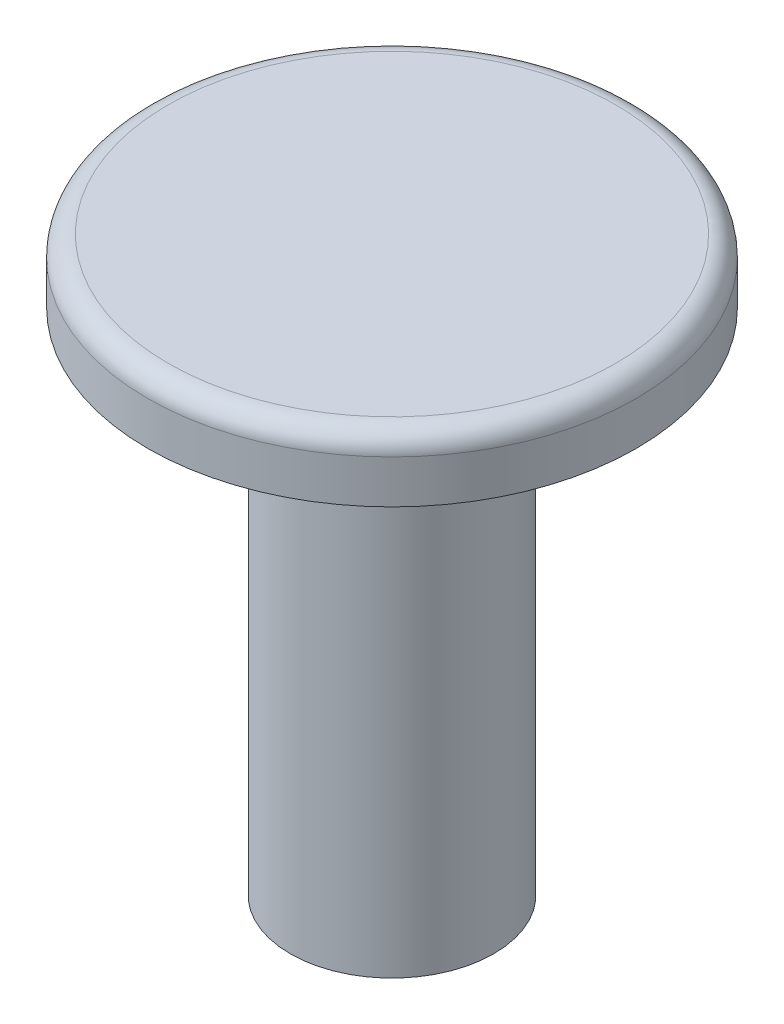
ISO-10303-21;
HEADER;
FILE_DESCRIPTION(('STEP AP214'),'2;1');
FILE_NAME('part.step','',(''),(''),'','','');
FILE_SCHEMA(('AUTOMOTIVE_DESIGN { 1 0 10303 214 1 1 1 1 }'));
ENDSEC;
DATA;
#1=APPLICATION_CONTEXT('core data for automotive mechanical design processes');
#2=APPLICATION_PROTOCOL_DEFINITION('international standard','automotive_design',2000,#1);
#3=PRODUCT_CONTEXT('',#1,'mechanical');
#4=PRODUCT('Part','Part','',(#3));
#5=PRODUCT_RELATED_PRODUCT_CATEGORY('part','',(#4));
#6=PRODUCT_DEFINITION_FORMATION('','',#4);
#7=PRODUCT_DEFINITION_CONTEXT('part definition',#1,'design');
#8=PRODUCT_DEFINITION('design','',#6,#7);
#9=PRODUCT_DEFINITION_SHAPE('','',#8);
#10=(LENGTH_UNIT() NAMED_UNIT(*) SI_UNIT(.MILLI.,.METRE.));
#11=(NAMED_UNIT(*) PLANE_ANGLE_UNIT() SI_UNIT($,.RADIAN.));
#12=(NAMED_UNIT(*) SI_UNIT($,.STERADIAN.) SOLID_ANGLE_UNIT());
#13=UNCERTAINTY_MEASURE_WITH_UNIT(LENGTH_MEASURE(1.E-05),#10,'distance_accuracy_value','');
#14=(GEOMETRIC_REPRESENTATION_CONTEXT(3) GLOBAL_UNCERTAINTY_ASSIGNED_CONTEXT((#13)) GLOBAL_UNIT_ASSIGNED_CONTEXT((#10,
#11,#12)) REPRESENTATION_CONTEXT('',''));
#15=CARTESIAN_POINT('',(0.,0.,0.));
#16=DIRECTION('',(0.,0.,1.));
#17=DIRECTION('',(1.,0.,0.));
#18=AXIS2_PLACEMENT_3D('',#15,#16,#17);
#19=CARTESIAN_POINT('',(0.,10.,0.));
#20=DIRECTION('',(0.,-1.,0.));
#21=DIRECTION('',(0.,0.,-1.));
#22=AXIS2_PLACEMENT_3D('',#19,#20,#21);
#23=CYLINDRICAL_SURFACE('',#22,2.);
#24=CARTESIAN_POINT('',(0.,10.,0.));
#25=DIRECTION('',(0.,1.,0.));
#26=DIRECTION('',(0.,0.,1.));
#27=AXIS2_PLACEMENT_3D('',#24,#25,#26);
#28=CIRCLE('',#27,2.);
#29=CARTESIAN_POINT('',(0.,10.,2.));
#30=VERTEX_POINT('',#29);
#31=EDGE_CURVE('E43',#30,#30,#28,.T.);
#32=ORIENTED_EDGE('',*,*,#31,.F.);
#33=EDGE_LOOP('',(#32));
#34=FACE_BOUND('',#33,.T.);
#35=CARTESIAN_POINT('',(0.,0.,0.));
#36=DIRECTION('',(0.,1.,0.));
#37=DIRECTION('',(0.,0.,1.));
#38=AXIS2_PLACEMENT_3D('',#35,#36,#37);
#39=CIRCLE('',#38,2.);
#40=CARTESIAN_POINT('',(0.,0.,2.));
#41=VERTEX_POINT('',#40);
#42=EDGE_CURVE('E47',#41,#41,#39,.T.);
#43=ORIENTED_EDGE('',*,*,#42,.T.);
#44=EDGE_LOOP('',(#43));
#45=FACE_BOUND('',#44,.T.);
#46=ADVANCED_FACE('F32',(#34,#45),#23,.T.);
#47=CARTESIAN_POINT('',(0.,0.,0.));
#48=DIRECTION('',(0.,1.,0.));
#49=DIRECTION('',(0.,0.,1.));
#50=AXIS2_PLACEMENT_3D('',#47,#48,#49);
#51=PLANE('',#50);
#52=ORIENTED_EDGE('',*,*,#42,.F.);
#53=EDGE_LOOP('',(#52));
#54=FACE_BOUND('',#53,.T.);
#55=ADVANCED_FACE('F71',(#54),#51,.F.);
#56=CARTESIAN_POINT('',(0.,11.25,0.));
#57=DIRECTION('',(0.,-1.,0.));
#58=DIRECTION('',(0.,0.,-1.));
#59=AXIS2_PLACEMENT_3D('',#56,#57,#58);
#60=CYLINDRICAL_SURFACE('',#59,4.8);
#61=CARTESIAN_POINT('',(0.,10.85,0.));
#62=DIRECTION('',(0.,1.,0.));
#63=DIRECTION('',(0.,0.,1.));
#64=AXIS2_PLACEMENT_3D('',#61,#62,#63);
#65=CIRCLE('',#64,4.8);
#66=CARTESIAN_POINT('',(0.,10.85,4.8));
#67=VERTEX_POINT('',#66);
#68=EDGE_CURVE('E10',#67,#67,#65,.F.);
#69=ORIENTED_EDGE('',*,*,#68,.T.);
#70=EDGE_LOOP('',(#69));
#71=FACE_BOUND('',#70,.T.);
#72=CARTESIAN_POINT('',(0.,10.,0.));
#73=DIRECTION('',(0.,1.,0.));
#74=DIRECTION('',(0.,0.,1.));
#75=AXIS2_PLACEMENT_3D('',#72,#73,#74);
#76=CIRCLE('',#75,4.8);
#77=CARTESIAN_POINT('',(0.,10.,4.8));
#78=VERTEX_POINT('',#77);
#79=EDGE_CURVE('E51',#78,#78,#76,.T.);
#80=ORIENTED_EDGE('',*,*,#79,.T.);
#81=EDGE_LOOP('',(#80));
#82=FACE_BOUND('',#81,.T.);
#83=ADVANCED_FACE('F56',(#71,#82),#60,.T.);
#84=CARTESIAN_POINT('',(0.,11.25,0.));
#85=DIRECTION('',(0.,1.,0.));
#86=DIRECTION('',(0.,0.,1.));
#87=AXIS2_PLACEMENT_3D('',#84,#85,#86);
#88=PLANE('',#87);
#89=CARTESIAN_POINT('',(0.,11.25,0.));
#90=DIRECTION('',(0.,1.,0.));
#91=DIRECTION('',(0.,0.,1.));
#92=AXIS2_PLACEMENT_3D('',#89,#90,#91);
#93=CIRCLE('',#92,4.4);
#94=CARTESIAN_POINT('',(0.,11.25,4.4));
#95=VERTEX_POINT('',#94);
#96=EDGE_CURVE('E39',#95,#95,#93,.T.);
#97=ORIENTED_EDGE('',*,*,#96,.T.);
#98=EDGE_LOOP('',(#97));
#99=FACE_BOUND('',#98,.T.);
#100=ADVANCED_FACE('F60',(#99),#88,.T.);
#101=CARTESIAN_POINT('',(0.,10.,0.));
#102=DIRECTION('',(0.,1.,0.));
#103=DIRECTION('',(0.,0.,1.));
#104=AXIS2_PLACEMENT_3D('',#101,#102,#103);
#105=PLANE('',#104);
#106=ORIENTED_EDGE('',*,*,#31,.T.);
#107=EDGE_LOOP('',(#106));
#108=FACE_BOUND('',#107,.T.);
#109=ORIENTED_EDGE('',*,*,#79,.F.);
#110=EDGE_LOOP('',(#109));
#111=FACE_BOUND('',#110,.T.);
#112=ADVANCED_FACE('F58',(#108,#111),#105,.F.);
#113=CARTESIAN_POINT('',(0.,10.85,0.));
#114=DIRECTION('',(0.,1.,0.));
#115=DIRECTION('',(0.,0.,1.));
#116=AXIS2_PLACEMENT_3D('',#113,#114,#115);
#117=TOROIDAL_SURFACE('',#116,4.4,0.4);
#118=ORIENTED_EDGE('',*,*,#68,.F.);
#119=EDGE_LOOP('',(#118));
#120=FACE_BOUND('',#119,.T.);
#121=ORIENTED_EDGE('',*,*,#96,.F.);
#122=EDGE_LOOP('',(#121));
#123=FACE_BOUND('',#122,.T.);
#124=ADVANCED_FACE('F34',(#120,#123),#117,.T.);
#125=CLOSED_SHELL('',(#46,#55,#83,#100,#112,#124));
#126=MANIFOLD_SOLID_BREP('B2',#125);
#127=ADVANCED_BREP_SHAPE_REPRESENTATION('',(#18,#126),#14);
#128=SHAPE_DEFINITION_REPRESENTATION(#9,#127);
ENDSEC;
END-ISO-10303-21;
